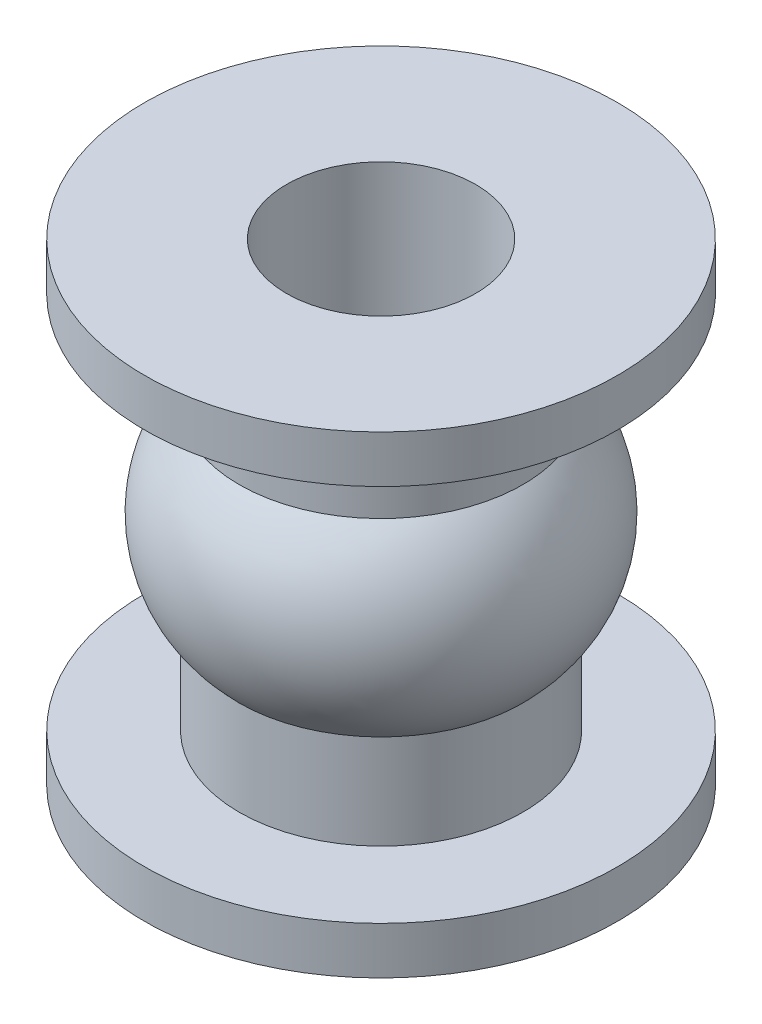
ISO-10303-21;
HEADER;
FILE_DESCRIPTION(('STEP AP214'),'2;1');
FILE_NAME('part.step','',(''),(''),'','','');
FILE_SCHEMA(('AUTOMOTIVE_DESIGN { 1 0 10303 214 1 1 1 1 }'));
ENDSEC;
DATA;
#1=APPLICATION_CONTEXT('core data for automotive mechanical design processes');
#2=APPLICATION_PROTOCOL_DEFINITION('international standard','automotive_design',2000,#1);
#3=PRODUCT_CONTEXT('',#1,'mechanical');
#4=PRODUCT('Part','Part','',(#3));
#5=PRODUCT_RELATED_PRODUCT_CATEGORY('part','',(#4));
#6=PRODUCT_DEFINITION_FORMATION('','',#4);
#7=PRODUCT_DEFINITION_CONTEXT('part definition',#1,'design');
#8=PRODUCT_DEFINITION('design','',#6,#7);
#9=PRODUCT_DEFINITION_SHAPE('','',#8);
#10=(LENGTH_UNIT() NAMED_UNIT(*) SI_UNIT(.MILLI.,.METRE.));
#11=(NAMED_UNIT(*) PLANE_ANGLE_UNIT() SI_UNIT($,.RADIAN.));
#12=(NAMED_UNIT(*) SI_UNIT($,.STERADIAN.) SOLID_ANGLE_UNIT());
#13=UNCERTAINTY_MEASURE_WITH_UNIT(LENGTH_MEASURE(1.E-05),#10,'distance_accuracy_value','');
#14=(GEOMETRIC_REPRESENTATION_CONTEXT(3) GLOBAL_UNCERTAINTY_ASSIGNED_CONTEXT((#13)) GLOBAL_UNIT_ASSIGNED_CONTEXT((#10,
#11,#12)) REPRESENTATION_CONTEXT('',''));
#15=CARTESIAN_POINT('',(0.,0.,0.));
#16=DIRECTION('',(0.,0.,1.));
#17=DIRECTION('',(1.,0.,0.));
#18=AXIS2_PLACEMENT_3D('',#15,#16,#17);
#19=CARTESIAN_POINT('',(0.,0.,0.));
#20=DIRECTION('',(0.,-1.,0.));
#21=DIRECTION('',(0.,0.,-1.));
#22=AXIS2_PLACEMENT_3D('',#19,#20,#21);
#23=CYLINDRICAL_SURFACE('',#22,2.);
#24=CARTESIAN_POINT('',(0.,10.,0.));
#25=DIRECTION('',(0.,-1.,0.));
#26=DIRECTION('',(0.,0.,-1.));
#27=AXIS2_PLACEMENT_3D('',#24,#25,#26);
#28=CIRCLE('',#27,2.);
#29=CARTESIAN_POINT('',(0.,10.,-2.));
#30=VERTEX_POINT('',#29);
#31=EDGE_CURVE('E10',#30,#30,#28,.T.);
#32=ORIENTED_EDGE('',*,*,#31,.F.);
#33=EDGE_LOOP('',(#32));
#34=FACE_BOUND('',#33,.T.);
#35=CARTESIAN_POINT('',(0.,0.,0.));
#36=DIRECTION('',(0.,-1.,0.));
#37=DIRECTION('',(0.,0.,-1.));
#38=AXIS2_PLACEMENT_3D('',#35,#36,#37);
#39=CIRCLE('',#38,2.);
#40=CARTESIAN_POINT('',(0.,0.,-2.));
#41=VERTEX_POINT('',#40);
#42=EDGE_CURVE('E68',#41,#41,#39,.T.);
#43=ORIENTED_EDGE('',*,*,#42,.T.);
#44=EDGE_LOOP('',(#43));
#45=FACE_BOUND('',#44,.T.);
#46=ADVANCED_FACE('F34',(#34,#45),#23,.F.);
#47=CARTESIAN_POINT('',(-2.,10.,0.));
#48=DIRECTION('',(0.,-1.,0.));
#49=DIRECTION('',(0.,0.,-1.));
#50=AXIS2_PLACEMENT_3D('',#47,#48,#49);
#51=PLANE('',#50);
#52=CARTESIAN_POINT('',(0.,10.,0.));
#53=DIRECTION('',(0.,-1.,0.));
#54=DIRECTION('',(0.,0.,-1.));
#55=AXIS2_PLACEMENT_3D('',#52,#53,#54);
#56=CIRCLE('',#55,5.);
#57=CARTESIAN_POINT('',(0.,10.,-5.));
#58=VERTEX_POINT('',#57);
#59=EDGE_CURVE('E40',#58,#58,#56,.T.);
#60=ORIENTED_EDGE('',*,*,#59,.F.);
#61=EDGE_LOOP('',(#60));
#62=FACE_BOUND('',#61,.T.);
#63=ORIENTED_EDGE('',*,*,#31,.T.);
#64=EDGE_LOOP('',(#63));
#65=FACE_BOUND('',#64,.T.);
#66=ADVANCED_FACE('F117',(#62,#65),#51,.F.);
#67=CARTESIAN_POINT('',(0.,0.,0.));
#68=DIRECTION('',(0.,-1.,0.));
#69=DIRECTION('',(0.,0.,-1.));
#70=AXIS2_PLACEMENT_3D('',#67,#68,#69);
#71=CYLINDRICAL_SURFACE('',#70,5.);
#72=CARTESIAN_POINT('',(0.,9.,0.));
#73=DIRECTION('',(0.,-1.,0.));
#74=DIRECTION('',(0.,0.,-1.));
#75=AXIS2_PLACEMENT_3D('',#72,#73,#74);
#76=CIRCLE('',#75,5.);
#77=CARTESIAN_POINT('',(0.,9.,-5.));
#78=VERTEX_POINT('',#77);
#79=EDGE_CURVE('E44',#78,#78,#76,.T.);
#80=ORIENTED_EDGE('',*,*,#79,.F.);
#81=EDGE_LOOP('',(#80));
#82=FACE_BOUND('',#81,.T.);
#83=ORIENTED_EDGE('',*,*,#59,.T.);
#84=EDGE_LOOP('',(#83));
#85=FACE_BOUND('',#84,.T.);
#86=ADVANCED_FACE('F112',(#82,#85),#71,.T.);
#87=CARTESIAN_POINT('',(-5.,9.,0.));
#88=DIRECTION('',(0.,1.,0.));
#89=DIRECTION('',(0.,0.,1.));
#90=AXIS2_PLACEMENT_3D('',#87,#88,#89);
#91=PLANE('',#90);
#92=CARTESIAN_POINT('',(0.,9.,0.));
#93=DIRECTION('',(0.,-1.,0.));
#94=DIRECTION('',(0.,0.,-1.));
#95=AXIS2_PLACEMENT_3D('',#92,#93,#94);
#96=CIRCLE('',#95,3.);
#97=CARTESIAN_POINT('',(0.,9.,-3.));
#98=VERTEX_POINT('',#97);
#99=EDGE_CURVE('E48',#98,#98,#96,.T.);
#100=ORIENTED_EDGE('',*,*,#99,.F.);
#101=EDGE_LOOP('',(#100));
#102=FACE_BOUND('',#101,.T.);
#103=ORIENTED_EDGE('',*,*,#79,.T.);
#104=EDGE_LOOP('',(#103));
#105=FACE_BOUND('',#104,.T.);
#106=ADVANCED_FACE('F106',(#102,#105),#91,.F.);
#107=CARTESIAN_POINT('',(0.,0.,0.));
#108=DIRECTION('',(0.,-1.,0.));
#109=DIRECTION('',(0.,0.,-1.));
#110=AXIS2_PLACEMENT_3D('',#107,#108,#109);
#111=CYLINDRICAL_SURFACE('',#110,3.);
#112=CARTESIAN_POINT('',(0.,7.,0.));
#113=DIRECTION('',(0.,-1.,0.));
#114=DIRECTION('',(0.,0.,-1.));
#115=AXIS2_PLACEMENT_3D('',#112,#113,#114);
#116=CIRCLE('',#115,3.);
#117=CARTESIAN_POINT('',(0.,7.,-3.));
#118=VERTEX_POINT('',#117);
#119=EDGE_CURVE('E53',#118,#118,#116,.T.);
#120=ORIENTED_EDGE('',*,*,#119,.F.);
#121=EDGE_LOOP('',(#120));
#122=FACE_BOUND('',#121,.T.);
#123=ORIENTED_EDGE('',*,*,#99,.T.);
#124=EDGE_LOOP('',(#123));
#125=FACE_BOUND('',#124,.T.);
#126=ADVANCED_FACE('F100',(#122,#125),#111,.T.);
#127=CARTESIAN_POINT('',(0.,5.,0.));
#128=DIRECTION('',(0.,-1.,0.));
#129=DIRECTION('',(0.,0.,-1.));
#130=AXIS2_PLACEMENT_3D('',#127,#128,#129);
#131=DEGENERATE_TOROIDAL_SURFACE('',#130,0.999999999999999,2.82842712474619,.T.);
#132=CARTESIAN_POINT('',(0.,3.,0.));
#133=DIRECTION('',(0.,-1.,0.));
#134=DIRECTION('',(0.,0.,-1.));
#135=AXIS2_PLACEMENT_3D('',#132,#133,#134);
#136=CIRCLE('',#135,3.);
#137=CARTESIAN_POINT('',(0.,3.,-3.));
#138=VERTEX_POINT('',#137);
#139=EDGE_CURVE('E56',#138,#138,#136,.T.);
#140=ORIENTED_EDGE('',*,*,#139,.F.);
#141=EDGE_LOOP('',(#140));
#142=FACE_BOUND('',#141,.T.);
#143=ORIENTED_EDGE('',*,*,#119,.T.);
#144=EDGE_LOOP('',(#143));
#145=FACE_BOUND('',#144,.T.);
#146=ADVANCED_FACE('F94',(#142,#145),#131,.T.);
#147=CARTESIAN_POINT('',(0.,0.,0.));
#148=DIRECTION('',(0.,-1.,0.));
#149=DIRECTION('',(0.,0.,-1.));
#150=AXIS2_PLACEMENT_3D('',#147,#148,#149);
#151=CYLINDRICAL_SURFACE('',#150,3.);
#152=CARTESIAN_POINT('',(0.,1.,0.));
#153=DIRECTION('',(0.,-1.,0.));
#154=DIRECTION('',(0.,0.,-1.));
#155=AXIS2_PLACEMENT_3D('',#152,#153,#154);
#156=CIRCLE('',#155,3.);
#157=CARTESIAN_POINT('',(0.,1.,-3.));
#158=VERTEX_POINT('',#157);
#159=EDGE_CURVE('E59',#158,#158,#156,.T.);
#160=ORIENTED_EDGE('',*,*,#159,.F.);
#161=EDGE_LOOP('',(#160));
#162=FACE_BOUND('',#161,.T.);
#163=ORIENTED_EDGE('',*,*,#139,.T.);
#164=EDGE_LOOP('',(#163));
#165=FACE_BOUND('',#164,.T.);
#166=ADVANCED_FACE('F88',(#162,#165),#151,.T.);
#167=CARTESIAN_POINT('',(-3.,1.,0.));
#168=DIRECTION('',(0.,-1.,0.));
#169=DIRECTION('',(0.,0.,-1.));
#170=AXIS2_PLACEMENT_3D('',#167,#168,#169);
#171=PLANE('',#170);
#172=CARTESIAN_POINT('',(0.,1.,0.));
#173=DIRECTION('',(0.,-1.,0.));
#174=DIRECTION('',(0.,0.,-1.));
#175=AXIS2_PLACEMENT_3D('',#172,#173,#174);
#176=CIRCLE('',#175,5.);
#177=CARTESIAN_POINT('',(0.,1.,-5.));
#178=VERTEX_POINT('',#177);
#179=EDGE_CURVE('E62',#178,#178,#176,.T.);
#180=ORIENTED_EDGE('',*,*,#179,.F.);
#181=EDGE_LOOP('',(#180));
#182=FACE_BOUND('',#181,.T.);
#183=ORIENTED_EDGE('',*,*,#159,.T.);
#184=EDGE_LOOP('',(#183));
#185=FACE_BOUND('',#184,.T.);
#186=ADVANCED_FACE('F82',(#182,#185),#171,.F.);
#187=CARTESIAN_POINT('',(0.,0.,0.));
#188=DIRECTION('',(0.,-1.,0.));
#189=DIRECTION('',(0.,0.,-1.));
#190=AXIS2_PLACEMENT_3D('',#187,#188,#189);
#191=CYLINDRICAL_SURFACE('',#190,5.);
#192=CARTESIAN_POINT('',(0.,0.,0.));
#193=DIRECTION('',(0.,-1.,0.));
#194=DIRECTION('',(0.,0.,-1.));
#195=AXIS2_PLACEMENT_3D('',#192,#193,#194);
#196=CIRCLE('',#195,5.);
#197=CARTESIAN_POINT('',(0.,0.,-5.));
#198=VERTEX_POINT('',#197);
#199=EDGE_CURVE('E65',#198,#198,#196,.T.);
#200=ORIENTED_EDGE('',*,*,#199,.F.);
#201=EDGE_LOOP('',(#200));
#202=FACE_BOUND('',#201,.T.);
#203=ORIENTED_EDGE('',*,*,#179,.T.);
#204=EDGE_LOOP('',(#203));
#205=FACE_BOUND('',#204,.T.);
#206=ADVANCED_FACE('F76',(#202,#205),#191,.T.);
#207=CARTESIAN_POINT('',(-5.,0.,0.));
#208=DIRECTION('',(0.,1.,0.));
#209=DIRECTION('',(0.,0.,1.));
#210=AXIS2_PLACEMENT_3D('',#207,#208,#209);
#211=PLANE('',#210);
#212=ORIENTED_EDGE('',*,*,#42,.F.);
#213=EDGE_LOOP('',(#212));
#214=FACE_BOUND('',#213,.T.);
#215=ORIENTED_EDGE('',*,*,#199,.T.);
#216=EDGE_LOOP('',(#215));
#217=FACE_BOUND('',#216,.T.);
#218=ADVANCED_FACE('F73',(#214,#217),#211,.F.);
#219=CLOSED_SHELL('',(#46,#66,#86,#106,#126,#146,#166,#186,#206,#218));
#220=MANIFOLD_SOLID_BREP('B2',#219);
#221=ADVANCED_BREP_SHAPE_REPRESENTATION('',(#18,#220),#14);
#222=SHAPE_DEFINITION_REPRESENTATION(#9,#221);
ENDSEC;
END-ISO-10303-21;
